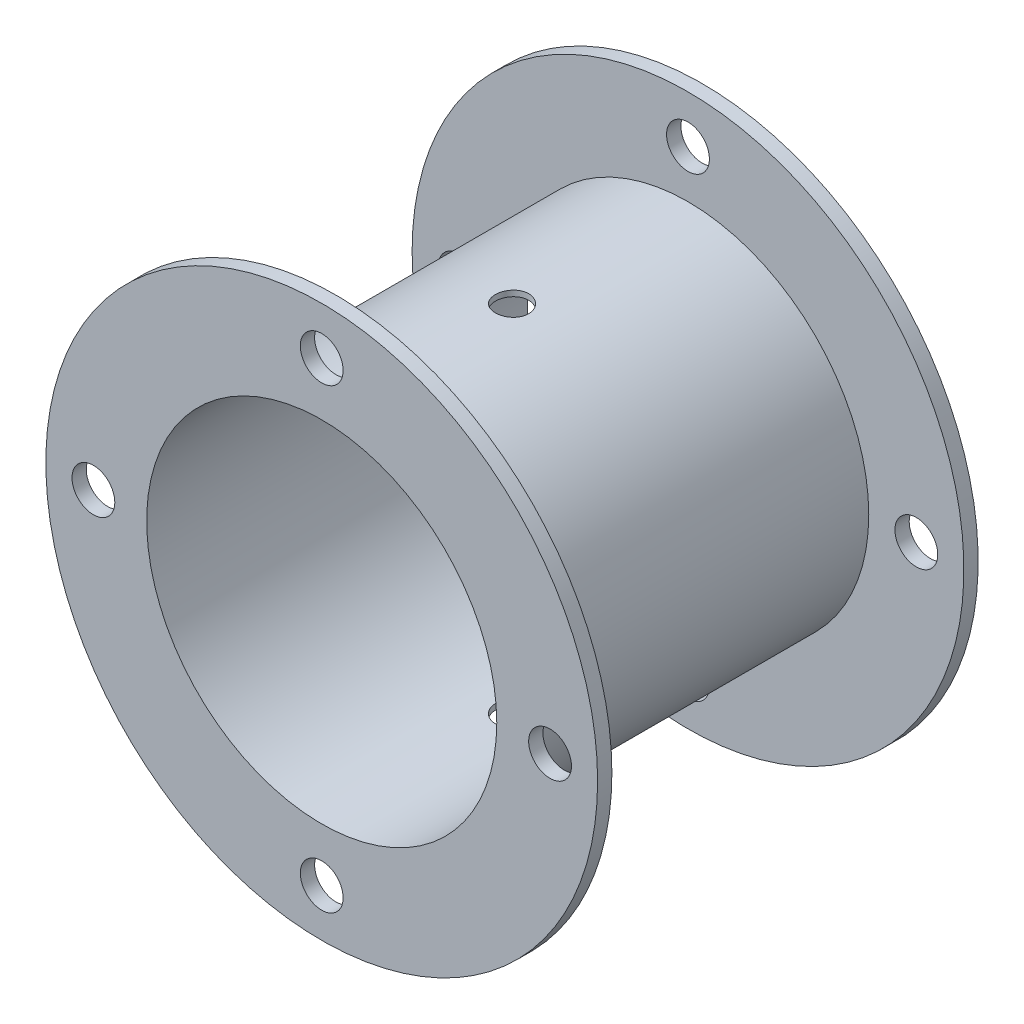
ISO-10303-21;
HEADER;
FILE_DESCRIPTION(('STEP AP214'),'2;1');
FILE_NAME('part.step','',(''),(''),'','','');
FILE_SCHEMA(('AUTOMOTIVE_DESIGN { 1 0 10303 214 1 1 1 1 }'));
ENDSEC;
DATA;
#1=APPLICATION_CONTEXT('core data for automotive mechanical design processes');
#2=APPLICATION_PROTOCOL_DEFINITION('international standard','automotive_design',2000,#1);
#3=PRODUCT_CONTEXT('',#1,'mechanical');
#4=PRODUCT('Part','Part','',(#3));
#5=PRODUCT_RELATED_PRODUCT_CATEGORY('part','',(#4));
#6=PRODUCT_DEFINITION_FORMATION('','',#4);
#7=PRODUCT_DEFINITION_CONTEXT('part definition',#1,'design');
#8=PRODUCT_DEFINITION('design','',#6,#7);
#9=PRODUCT_DEFINITION_SHAPE('','',#8);
#10=(LENGTH_UNIT() NAMED_UNIT(*) SI_UNIT(.MILLI.,.METRE.));
#11=(NAMED_UNIT(*) PLANE_ANGLE_UNIT() SI_UNIT($,.RADIAN.));
#12=(NAMED_UNIT(*) SI_UNIT($,.STERADIAN.) SOLID_ANGLE_UNIT());
#13=UNCERTAINTY_MEASURE_WITH_UNIT(LENGTH_MEASURE(1.E-05),#10,'distance_accuracy_value','');
#14=(GEOMETRIC_REPRESENTATION_CONTEXT(3) GLOBAL_UNCERTAINTY_ASSIGNED_CONTEXT((#13)) GLOBAL_UNIT_ASSIGNED_CONTEXT((#10,
#11,#12)) REPRESENTATION_CONTEXT('',''));
#15=CARTESIAN_POINT('',(0.,0.,0.));
#16=DIRECTION('',(0.,0.,1.));
#17=DIRECTION('',(1.,0.,0.));
#18=AXIS2_PLACEMENT_3D('',#15,#16,#17);
#19=CARTESIAN_POINT('',(0.,0.,80.));
#20=DIRECTION('',(0.,0.,-1.));
#21=DIRECTION('',(-1.,0.,0.));
#22=AXIS2_PLACEMENT_3D('',#19,#20,#21);
#23=CYLINDRICAL_SURFACE('',#22,38.);
#24=CARTESIAN_POINT('',(0.,0.,77.));
#25=DIRECTION('',(0.,0.,1.));
#26=DIRECTION('',(1.,0.,0.));
#27=AXIS2_PLACEMENT_3D('',#24,#25,#26);
#28=CIRCLE('',#27,38.);
#29=CARTESIAN_POINT('',(38.,0.,77.));
#30=VERTEX_POINT('',#29);
#31=EDGE_CURVE('E38',#30,#30,#28,.T.);
#32=ORIENTED_EDGE('',*,*,#31,.F.);
#33=EDGE_LOOP('',(#32));
#34=FACE_BOUND('',#33,.T.);
#35=CARTESIAN_POINT('',(0.,-38.,43.5));
#36=CARTESIAN_POINT('',(0.196150644820294,-37.9999979047221,43.4999914683142));
#37=CARTESIAN_POINT('',(0.392432884557335,-37.9984650828304,43.483455190687));
#38=CARTESIAN_POINT('',(0.779561101311674,-37.9924977373456,43.417735303349));
#39=CARTESIAN_POINT('',(0.970400756155842,-37.9880599720131,43.3685152196215));
#40=CARTESIAN_POINT('',(1.34098135315322,-37.9767839543002,43.238867982207));
#41=CARTESIAN_POINT('',(1.52072871765281,-37.9699471065974,43.1584590868663));
#42=CARTESIAN_POINT('',(1.86413444479786,-37.9546385119936,42.968750830383));
#43=CARTESIAN_POINT('',(2.0277961171604,-37.9461671024797,42.8594574295255));
#44=CARTESIAN_POINT('',(2.33492958465199,-37.9285099963569,42.614720565895));
#45=CARTESIAN_POINT('',(2.47834496663254,-37.9193224105036,42.4792064370732));
#46=CARTESIAN_POINT('',(2.74043033310537,-37.9012841843858,42.1860250010239));
#47=CARTESIAN_POINT('',(2.85909920205823,-37.8924335593257,42.0283566956519));
#48=CARTESIAN_POINT('',(3.06851878243947,-37.8760516123891,41.6949946371842));
#49=CARTESIAN_POINT('',(3.15921911197315,-37.8685226817661,41.5192691063704));
#50=CARTESIAN_POINT('',(3.30980521230169,-37.8556592176664,41.155001689945));
#51=CARTESIAN_POINT('',(3.36969163633667,-37.850324637671,40.9664600761241));
#52=CARTESIAN_POINT('',(3.45678435363085,-37.8424704319935,40.582483394705));
#53=CARTESIAN_POINT('',(3.4840834814771,-37.8399428112952,40.387069549888));
#54=CARTESIAN_POINT('',(3.50551356747673,-37.8379636949375,39.9944184490417));
#55=CARTESIAN_POINT('',(3.49964527354044,-37.8385121299145,39.7971812342287));
#56=CARTESIAN_POINT('',(3.45498371141016,-37.8426158728127,39.4071203078185));
#57=CARTESIAN_POINT('',(3.41629157129158,-37.8461619450956,39.2142849063783));
#58=CARTESIAN_POINT('',(3.3072378788012,-37.8558469568506,38.8378568508929));
#59=CARTESIAN_POINT('',(3.23687595722433,-37.8619859265506,38.6542643046284));
#60=CARTESIAN_POINT('',(3.06636759819226,-37.8761756605001,38.3012126174303));
#61=CARTESIAN_POINT('',(2.96617604348657,-37.8842293169646,38.131775387097));
#62=CARTESIAN_POINT('',(2.73888495846409,-37.9013384317566,37.812083717406));
#63=CARTESIAN_POINT('',(2.61178476085357,-37.9103939149253,37.6618297539125));
#64=CARTESIAN_POINT('',(2.33371829504063,-37.9285274872688,37.3841819485944));
#65=CARTESIAN_POINT('',(2.18266464555371,-37.9376055345223,37.2568756006666));
#66=CARTESIAN_POINT('',(1.86128326315493,-37.9547292913956,37.029414106393));
#67=CARTESIAN_POINT('',(1.69095551328887,-37.9627750001073,36.9292589839306));
#68=CARTESIAN_POINT('',(1.33580214876888,-37.9769296216879,36.7589474472372));
#69=CARTESIAN_POINT('',(1.15097452821268,-37.9830382659933,36.6887951922736));
#70=CARTESIAN_POINT('',(0.772095350053787,-37.9926275899209,36.5805434551237));
#71=CARTESIAN_POINT('',(0.578044026496838,-37.9961083361866,36.542443160097));
#72=CARTESIAN_POINT('',(0.186983884102311,-38.0000411245853,36.4994872219674));
#73=CARTESIAN_POINT('',(-0.0100115602739527,-38.0005041712397,36.4945107860255));
#74=CARTESIAN_POINT('',(-0.402033797784186,-37.9983788378088,36.5176269784321));
#75=CARTESIAN_POINT('',(-0.597060613393788,-37.9957904926006,36.5457192288072));
#76=CARTESIAN_POINT('',(-0.979262950447385,-37.9878604071442,36.6340751926183));
#77=CARTESIAN_POINT('',(-1.166451589926,-37.982523483839,36.6942826300597));
#78=CARTESIAN_POINT('',(-1.52807103626715,-37.9696953634497,36.8451022431117));
#79=CARTESIAN_POINT('',(-1.70250159848494,-37.9622041250687,36.9357150015787));
#80=CARTESIAN_POINT('',(-2.03420136182215,-37.9458787873742,37.1450746372046));
#81=CARTESIAN_POINT('',(-2.19142007560226,-37.9370409102518,37.2639012049432));
#82=CARTESIAN_POINT('',(-2.48372292647603,-37.9190269942628,37.5262007240593));
#83=CARTESIAN_POINT('',(-2.61880659317513,-37.9098509482148,37.6696741990785));
#84=CARTESIAN_POINT('',(-2.86342171901026,-37.8921620405234,37.977720479837));
#85=CARTESIAN_POINT('',(-2.97287412455199,-37.8836512832104,38.1423561986255));
#86=CARTESIAN_POINT('',(-3.16257702759339,-37.8682875646041,38.4877418503275));
#87=CARTESIAN_POINT('',(-3.24282787149239,-37.8614345836461,38.6684915920591));
#88=CARTESIAN_POINT('',(-3.37171612741817,-37.8501748802,39.040698992471));
#89=CARTESIAN_POINT('',(-3.42040124811341,-37.8457644674746,39.2321400143293));
#90=CARTESIAN_POINT('',(-3.48493113271247,-37.839877399263,39.6205218879779));
#91=CARTESIAN_POINT('',(-3.50077668340927,-37.8384006734895,39.817462607888));
#92=CARTESIAN_POINT('',(-3.49916763237338,-37.8385494473553,40.2104677919904));
#93=CARTESIAN_POINT('',(-3.48183722449488,-37.8401633771654,40.4065327809341));
#94=CARTESIAN_POINT('',(-3.41462789351965,-37.8462869883637,40.7929541410503));
#95=CARTESIAN_POINT('',(-3.36474892689354,-37.8507966736244,40.983310504588));
#96=CARTESIAN_POINT('',(-3.23389127136178,-37.8622005431004,41.3529145560671));
#97=CARTESIAN_POINT('',(-3.15291554720815,-37.8690944999939,41.5321633011128));
#98=CARTESIAN_POINT('',(-2.96217623974758,-37.8844905801757,41.8745436773478));
#99=CARTESIAN_POINT('',(-2.85241296128982,-37.892992686434,42.0376754791841));
#100=CARTESIAN_POINT('',(-2.60674740036237,-37.9106851137562,42.3438275333614));
#101=CARTESIAN_POINT('',(-2.47075278410434,-37.9198777936938,42.4867735588355));
#102=CARTESIAN_POINT('',(-2.17666158023018,-37.9378939881382,42.7478744451619));
#103=CARTESIAN_POINT('',(-2.01855968036044,-37.946717413251,42.8660233302867));
#104=CARTESIAN_POINT('',(-1.68437203955847,-37.9630204121684,43.0743720209186));
#105=CARTESIAN_POINT('',(-1.50824769738496,-37.9704970026272,43.1645100926054));
#106=CARTESIAN_POINT('',(-1.14341115422001,-37.9832303954186,43.313815731244));
#107=CARTESIAN_POINT('',(-0.954713561226897,-37.9884897235019,43.3730185559877));
#108=CARTESIAN_POINT('',(-0.637437570268632,-37.9948602550693,43.4438538968278));
#109=CARTESIAN_POINT('',(-0.510893633779581,-37.9967787779037,43.4648803080498));
#110=CARTESIAN_POINT('',(-0.256251852214102,-37.9993493327044,43.4929561231492));
#111=CARTESIAN_POINT('',(-0.128154012376229,-38.000001368939,43.5000055741329));
#112=CARTESIAN_POINT('',(0.,-38.,43.5));
#113=B_SPLINE_CURVE_WITH_KNOTS('',3,(#35,#36,#37,#38,#39,#40,#41,#42,#43,#44,#45,#46,#47,#48,
#49,#50,#51,#52,#53,#54,#55,#56,#57,#58,#59,#60,#61,#62,#63,#64,#65,#66,#67,#68,#69,#70,#71,#72,
#73,#74,#75,#76,#77,#78,#79,#80,#81,#82,#83,#84,#85,#86,#87,#88,#89,#90,#91,#92,#93,#94,#95,#96,
#97,#98,#99,#100,#101,#102,#103,#104,#105,#106,#107,#108,#109,#110,#111,#112),.UNSPECIFIED.,.T.,
.F.,(4,2,2,2,2,2,2,2,2,2,2,2,2,2,2,2,2,2,2,2,2,2,2,2,2,2,2,2,2,2,2,2,2,2,2,2,2,2,4),(0.,
0.587983998143123,1.17662527167613,1.76492246558644,2.35309835968754,2.94288206705839,
3.53269235533819,4.12355899015469,4.71441309836413,5.3035799353251,5.89273348689403,
6.48007846045749,7.06743028144327,7.65567502319846,8.24393435424464,8.83439120834051,
9.42484858182812,10.0153877833185,10.6059120082341,11.1942815819089,11.782644430614,
12.3699796517192,12.9573261324231,13.5463517472255,14.1353898778599,14.7262215095193,
15.3170461322949,15.9069756837745,16.4968911011532,17.0846024940478,17.6723146729301,
18.2599708334812,18.8476207712294,19.4373782722155,20.0272777328681,20.6184682171211,
21.2089834267417,21.5931410348112,21.9772973481595),.UNSPECIFIED.);
#114=CARTESIAN_POINT('',(0.,-38.,43.5));
#115=VERTEX_POINT('',#114);
#116=EDGE_CURVE('E81',#115,#115,#113,.T.);
#117=ORIENTED_EDGE('',*,*,#116,.T.);
#118=EDGE_LOOP('',(#117));
#119=FACE_BOUND('',#118,.T.);
#120=CARTESIAN_POINT('',(0.,38.,43.5));
#121=CARTESIAN_POINT('',(-0.196150644820289,37.9999979047221,43.4999914683142));
#122=CARTESIAN_POINT('',(-0.392432884557329,37.9984650828304,43.483455190687));
#123=CARTESIAN_POINT('',(-0.779561101311668,37.9924977373456,43.417735303349));
#124=CARTESIAN_POINT('',(-0.970400756155836,37.9880599720131,43.3685152196215));
#125=CARTESIAN_POINT('',(-1.34098135315322,37.9767839543002,43.238867982207));
#126=CARTESIAN_POINT('',(-1.5207287176528,37.9699471065974,43.1584590868663));
#127=CARTESIAN_POINT('',(-1.86413444479785,37.9546385119936,42.968750830383));
#128=CARTESIAN_POINT('',(-2.02779611716039,37.9461671024797,42.8594574295255));
#129=CARTESIAN_POINT('',(-2.33492958465198,37.9285099963569,42.614720565895));
#130=CARTESIAN_POINT('',(-2.47834496663254,37.9193224105036,42.4792064370732));
#131=CARTESIAN_POINT('',(-2.74043033310536,37.9012841843858,42.1860250010239));
#132=CARTESIAN_POINT('',(-2.85909920205823,37.8924335593257,42.0283566956519));
#133=CARTESIAN_POINT('',(-3.06851878243947,37.8760516123891,41.6949946371842));
#134=CARTESIAN_POINT('',(-3.15921911197314,37.8685226817661,41.5192691063704));
#135=CARTESIAN_POINT('',(-3.30980521230169,37.8556592176664,41.155001689945));
#136=CARTESIAN_POINT('',(-3.36969163633667,37.850324637671,40.9664600761241));
#137=CARTESIAN_POINT('',(-3.45678435363084,37.8424704319935,40.582483394705));
#138=CARTESIAN_POINT('',(-3.48408348147709,37.8399428112952,40.387069549888));
#139=CARTESIAN_POINT('',(-3.50551356747672,37.8379636949375,39.9944184490417));
#140=CARTESIAN_POINT('',(-3.49964527354043,37.8385121299145,39.7971812342287));
#141=CARTESIAN_POINT('',(-3.45498371141015,37.8426158728127,39.4071203078185));
#142=CARTESIAN_POINT('',(-3.41629157129156,37.8461619450956,39.2142849063783));
#143=CARTESIAN_POINT('',(-3.30723787880119,37.8558469568506,38.8378568508929));
#144=CARTESIAN_POINT('',(-3.23687595722432,37.8619859265506,38.6542643046284));
#145=CARTESIAN_POINT('',(-3.06636759819225,37.8761756605001,38.3012126174303));
#146=CARTESIAN_POINT('',(-2.96617604348655,37.8842293169646,38.131775387097));
#147=CARTESIAN_POINT('',(-2.73888495846407,37.9013384317566,37.812083717406));
#148=CARTESIAN_POINT('',(-2.61178476085355,37.9103939149253,37.6618297539125));
#149=CARTESIAN_POINT('',(-2.33371829504062,37.9285274872688,37.3841819485944));
#150=CARTESIAN_POINT('',(-2.1826646455537,37.9376055345223,37.2568756006666));
#151=CARTESIAN_POINT('',(-1.86128326315492,37.9547292913956,37.029414106393));
#152=CARTESIAN_POINT('',(-1.69095551328886,37.9627750001073,36.9292589839306));
#153=CARTESIAN_POINT('',(-1.33580214876887,37.9769296216879,36.7589474472372));
#154=CARTESIAN_POINT('',(-1.15097452821267,37.9830382659933,36.6887951922736));
#155=CARTESIAN_POINT('',(-0.772095350053775,37.9926275899209,36.5805434551237));
#156=CARTESIAN_POINT('',(-0.578044026496825,37.9961083361867,36.542443160097));
#157=CARTESIAN_POINT('',(-0.186983884102298,38.0000411245853,36.4994872219674));
#158=CARTESIAN_POINT('',(0.0100115602739655,38.0005041712397,36.4945107860255));
#159=CARTESIAN_POINT('',(0.402033797784199,37.9983788378088,36.5176269784321));
#160=CARTESIAN_POINT('',(0.597060613393801,37.9957904926006,36.5457192288072));
#161=CARTESIAN_POINT('',(0.979262950447397,37.9878604071442,36.6340751926183));
#162=CARTESIAN_POINT('',(1.16645158992601,37.982523483839,36.6942826300597));
#163=CARTESIAN_POINT('',(1.52807103626716,37.9696953634497,36.8451022431117));
#164=CARTESIAN_POINT('',(1.70250159848495,37.9622041250687,36.9357150015787));
#165=CARTESIAN_POINT('',(2.03420136182217,37.9458787873742,37.1450746372046));
#166=CARTESIAN_POINT('',(2.19142007560227,37.9370409102518,37.2639012049432));
#167=CARTESIAN_POINT('',(2.48372292647605,37.9190269942628,37.5262007240593));
#168=CARTESIAN_POINT('',(2.61880659317514,37.9098509482148,37.6696741990785));
#169=CARTESIAN_POINT('',(2.86342171901028,37.8921620405234,37.977720479837));
#170=CARTESIAN_POINT('',(2.972874124552,37.8836512832104,38.1423561986255));
#171=CARTESIAN_POINT('',(3.1625770275934,37.8682875646041,38.4877418503275));
#172=CARTESIAN_POINT('',(3.2428278714924,37.8614345836461,38.6684915920591));
#173=CARTESIAN_POINT('',(3.37171612741818,37.8501748802,39.040698992471));
#174=CARTESIAN_POINT('',(3.42040124811342,37.8457644674746,39.2321400143293));
#175=CARTESIAN_POINT('',(3.48493113271248,37.839877399263,39.6205218879779));
#176=CARTESIAN_POINT('',(3.50077668340928,37.8384006734895,39.8174626078879));
#177=CARTESIAN_POINT('',(3.49916763237339,37.8385494473553,40.2104677919904));
#178=CARTESIAN_POINT('',(3.48183722449489,37.8401633771654,40.4065327809341));
#179=CARTESIAN_POINT('',(3.41462789351966,37.8462869883637,40.7929541410503));
#180=CARTESIAN_POINT('',(3.36474892689355,37.8507966736244,40.983310504588));
#181=CARTESIAN_POINT('',(3.23389127136179,37.8622005431004,41.3529145560671));
#182=CARTESIAN_POINT('',(3.15291554720816,37.8690944999939,41.5321633011128));
#183=CARTESIAN_POINT('',(2.96217623974758,37.8844905801757,41.8745436773478));
#184=CARTESIAN_POINT('',(2.85241296128983,37.892992686434,42.0376754791841));
#185=CARTESIAN_POINT('',(2.60674740036238,37.9106851137562,42.3438275333614));
#186=CARTESIAN_POINT('',(2.47075278410434,37.9198777936938,42.4867735588356));
#187=CARTESIAN_POINT('',(2.17666158023019,37.9378939881382,42.7478744451619));
#188=CARTESIAN_POINT('',(2.01855968036045,37.946717413251,42.8660233302867));
#189=CARTESIAN_POINT('',(1.68437203955848,37.9630204121684,43.0743720209186));
#190=CARTESIAN_POINT('',(1.50824769738497,37.9704970026272,43.1645100926054));
#191=CARTESIAN_POINT('',(1.14341115422002,37.9832303954186,43.313815731244));
#192=CARTESIAN_POINT('',(0.954713561226906,37.9884897235019,43.3730185559877));
#193=CARTESIAN_POINT('',(0.63743757026864,37.9948602550693,43.4438538968278));
#194=CARTESIAN_POINT('',(0.510893633779588,37.9967787779037,43.4648803080498));
#195=CARTESIAN_POINT('',(0.256251852214108,37.9993493327044,43.4929561231492));
#196=CARTESIAN_POINT('',(0.128154012376234,38.000001368939,43.5000055741329));
#197=CARTESIAN_POINT('',(0.,38.,43.5));
#198=B_SPLINE_CURVE_WITH_KNOTS('',3,(#120,#121,#122,#123,#124,#125,#126,#127,#128,#129,#130,
#131,#132,#133,#134,#135,#136,#137,#138,#139,#140,#141,#142,#143,#144,#145,#146,#147,#148,#149,
#150,#151,#152,#153,#154,#155,#156,#157,#158,#159,#160,#161,#162,#163,#164,#165,#166,#167,#168,
#169,#170,#171,#172,#173,#174,#175,#176,#177,#178,#179,#180,#181,#182,#183,#184,#185,#186,#187,
#188,#189,#190,#191,#192,#193,#194,#195,#196,#197),.UNSPECIFIED.,.T.,.F.,(4,2,2,2,2,2,2,2,2,2,2,
2,2,2,2,2,2,2,2,2,2,2,2,2,2,2,2,2,2,2,2,2,2,2,2,2,2,2,4),(0.,0.587983998143122,1.17662527167613,
1.76492246558643,2.35309835968753,2.94288206705839,3.5326923553382,4.1235589901547,
4.71441309836414,5.30357993532511,5.89273348689404,6.4800784604575,7.06743028144327,
7.65567502319847,8.24393435424465,8.8343912083405,9.42484858182811,10.0153877833185,
10.605912008234,11.1942815819089,11.782644430614,12.3699796517192,12.9573261324231,
13.5463517472255,14.1353898778599,14.7262215095193,15.3170461322949,15.9069756837745,
16.4968911011532,17.0846024940478,17.6723146729301,18.2599708334812,18.8476207712294,
19.4373782722155,20.0272777328681,20.6184682171211,21.2089834267417,21.5931410348112,
21.9772973481595),.UNSPECIFIED.);
#199=CARTESIAN_POINT('',(0.,38.,43.5));
#200=VERTEX_POINT('',#199);
#201=EDGE_CURVE('E56',#200,#200,#198,.T.);
#202=ORIENTED_EDGE('',*,*,#201,.T.);
#203=EDGE_LOOP('',(#202));
#204=FACE_BOUND('',#203,.T.);
#205=CARTESIAN_POINT('',(0.,0.,3.));
#206=DIRECTION('',(0.,0.,-1.));
#207=DIRECTION('',(-1.,0.,0.));
#208=AXIS2_PLACEMENT_3D('',#205,#206,#207);
#209=CIRCLE('',#208,38.);
#210=CARTESIAN_POINT('',(-38.,0.,3.));
#211=VERTEX_POINT('',#210);
#212=EDGE_CURVE('E10',#211,#211,#209,.T.);
#213=ORIENTED_EDGE('',*,*,#212,.F.);
#214=EDGE_LOOP('',(#213));
#215=FACE_BOUND('',#214,.T.);
#216=ADVANCED_FACE('F31',(#34,#119,#204,#215),#23,.T.);
#217=CARTESIAN_POINT('',(0.,0.,80.));
#218=DIRECTION('',(0.,0.,1.));
#219=DIRECTION('',(1.,0.,0.));
#220=AXIS2_PLACEMENT_3D('',#217,#218,#219);
#221=PLANE('',#220);
#222=CARTESIAN_POINT('',(0.,0.,80.));
#223=DIRECTION('',(0.,0.,1.));
#224=DIRECTION('',(1.,0.,0.));
#225=AXIS2_PLACEMENT_3D('',#222,#223,#224);
#226=CIRCLE('',#225,36.8);
#227=CARTESIAN_POINT('',(36.8,0.,80.));
#228=VERTEX_POINT('',#227);
#229=EDGE_CURVE('E42',#228,#228,#226,.T.);
#230=ORIENTED_EDGE('',*,*,#229,.F.);
#231=EDGE_LOOP('',(#230));
#232=FACE_BOUND('',#231,.T.);
#233=CARTESIAN_POINT('',(-5.02773312793411E-13,-48.,80.));
#234=DIRECTION('',(0.,0.,1.));
#235=DIRECTION('',(1.,0.,0.));
#236=AXIS2_PLACEMENT_3D('',#233,#234,#235);
#237=CIRCLE('',#236,4.5);
#238=CARTESIAN_POINT('',(4.49999999999949,-48.,80.));
#239=VERTEX_POINT('',#238);
#240=EDGE_CURVE('E123',#239,#239,#237,.T.);
#241=ORIENTED_EDGE('',*,*,#240,.F.);
#242=EDGE_LOOP('',(#241));
#243=FACE_BOUND('',#242,.T.);
#244=CARTESIAN_POINT('',(48.,-3.35182208528941E-13,80.));
#245=DIRECTION('',(0.,0.,1.));
#246=DIRECTION('',(1.,0.,0.));
#247=AXIS2_PLACEMENT_3D('',#244,#245,#246);
#248=CIRCLE('',#247,4.5);
#249=CARTESIAN_POINT('',(52.5,-3.35182208528941E-13,80.));
#250=VERTEX_POINT('',#249);
#251=EDGE_CURVE('E127',#250,#250,#248,.T.);
#252=ORIENTED_EDGE('',*,*,#251,.F.);
#253=EDGE_LOOP('',(#252));
#254=FACE_BOUND('',#253,.T.);
#255=CARTESIAN_POINT('',(1.6759110426447E-13,48.,80.));
#256=DIRECTION('',(0.,0.,1.));
#257=DIRECTION('',(1.,0.,0.));
#258=AXIS2_PLACEMENT_3D('',#255,#256,#257);
#259=CIRCLE('',#258,4.5);
#260=CARTESIAN_POINT('',(4.50000000000017,48.,80.));
#261=VERTEX_POINT('',#260);
#262=EDGE_CURVE('E131',#261,#261,#259,.T.);
#263=ORIENTED_EDGE('',*,*,#262,.F.);
#264=EDGE_LOOP('',(#263));
#265=FACE_BOUND('',#264,.T.);
#266=CARTESIAN_POINT('',(-48.,0.,80.));
#267=DIRECTION('',(0.,0.,1.));
#268=DIRECTION('',(1.,0.,0.));
#269=AXIS2_PLACEMENT_3D('',#266,#267,#268);
#270=CIRCLE('',#269,4.5);
#271=CARTESIAN_POINT('',(-43.5,0.,80.));
#272=VERTEX_POINT('',#271);
#273=EDGE_CURVE('E135',#272,#272,#270,.T.);
#274=ORIENTED_EDGE('',*,*,#273,.F.);
#275=EDGE_LOOP('',(#274));
#276=FACE_BOUND('',#275,.T.);
#277=CARTESIAN_POINT('',(0.,0.,80.));
#278=DIRECTION('',(0.,0.,1.));
#279=DIRECTION('',(1.,0.,0.));
#280=AXIS2_PLACEMENT_3D('',#277,#278,#279);
#281=CIRCLE('',#280,58.);
#282=CARTESIAN_POINT('',(58.,0.,80.));
#283=VERTEX_POINT('',#282);
#284=EDGE_CURVE('E82',#283,#283,#281,.T.);
#285=ORIENTED_EDGE('',*,*,#284,.T.);
#286=EDGE_LOOP('',(#285));
#287=FACE_BOUND('',#286,.T.);
#288=ADVANCED_FACE('F100',(#232,#243,#254,#265,#276,#287),#221,.T.);
#289=CARTESIAN_POINT('',(0.,0.,0.));
#290=DIRECTION('',(0.,0.,1.));
#291=DIRECTION('',(1.,0.,0.));
#292=AXIS2_PLACEMENT_3D('',#289,#290,#291);
#293=PLANE('',#292);
#294=CARTESIAN_POINT('',(0.,0.,0.));
#295=DIRECTION('',(0.,0.,1.));
#296=DIRECTION('',(1.,0.,0.));
#297=AXIS2_PLACEMENT_3D('',#294,#295,#296);
#298=CIRCLE('',#297,36.8);
#299=CARTESIAN_POINT('',(36.8,0.,0.));
#300=VERTEX_POINT('',#299);
#301=EDGE_CURVE('E46',#300,#300,#298,.T.);
#302=ORIENTED_EDGE('',*,*,#301,.T.);
#303=EDGE_LOOP('',(#302));
#304=FACE_BOUND('',#303,.T.);
#305=CARTESIAN_POINT('',(1.66533453693773E-13,48.,0.));
#306=DIRECTION('',(0.,0.,-1.));
#307=DIRECTION('',(-1.,0.,0.));
#308=AXIS2_PLACEMENT_3D('',#305,#306,#307);
#309=CIRCLE('',#308,4.5);
#310=CARTESIAN_POINT('',(-4.49999999999983,48.,0.));
#311=VERTEX_POINT('',#310);
#312=EDGE_CURVE('E185',#311,#311,#309,.T.);
#313=ORIENTED_EDGE('',*,*,#312,.F.);
#314=EDGE_LOOP('',(#313));
#315=FACE_BOUND('',#314,.T.);
#316=CARTESIAN_POINT('',(48.,-3.35182208528941E-13,0.));
#317=DIRECTION('',(0.,0.,-1.));
#318=DIRECTION('',(-1.,0.,0.));
#319=AXIS2_PLACEMENT_3D('',#316,#317,#318);
#320=CIRCLE('',#319,4.5);
#321=CARTESIAN_POINT('',(43.5,-3.35182208528941E-13,0.));
#322=VERTEX_POINT('',#321);
#323=EDGE_CURVE('E179',#322,#322,#320,.T.);
#324=ORIENTED_EDGE('',*,*,#323,.F.);
#325=EDGE_LOOP('',(#324));
#326=FACE_BOUND('',#325,.T.);
#327=CARTESIAN_POINT('',(-4.9960036108132E-13,-48.,0.));
#328=DIRECTION('',(0.,0.,-1.));
#329=DIRECTION('',(-1.,0.,0.));
#330=AXIS2_PLACEMENT_3D('',#327,#328,#329);
#331=CIRCLE('',#330,4.5);
#332=CARTESIAN_POINT('',(-4.5000000000005,-48.,0.));
#333=VERTEX_POINT('',#332);
#334=EDGE_CURVE('E173',#333,#333,#331,.T.);
#335=ORIENTED_EDGE('',*,*,#334,.F.);
#336=EDGE_LOOP('',(#335));
#337=FACE_BOUND('',#336,.T.);
#338=CARTESIAN_POINT('',(-48.,0.,0.));
#339=DIRECTION('',(0.,0.,-1.));
#340=DIRECTION('',(-1.,0.,0.));
#341=AXIS2_PLACEMENT_3D('',#338,#339,#340);
#342=CIRCLE('',#341,4.5);
#343=CARTESIAN_POINT('',(-52.5,0.,0.));
#344=VERTEX_POINT('',#343);
#345=EDGE_CURVE('E167',#344,#344,#342,.T.);
#346=ORIENTED_EDGE('',*,*,#345,.F.);
#347=EDGE_LOOP('',(#346));
#348=FACE_BOUND('',#347,.T.);
#349=CARTESIAN_POINT('',(0.,0.,0.));
#350=DIRECTION('',(0.,0.,-1.));
#351=DIRECTION('',(-1.,0.,0.));
#352=AXIS2_PLACEMENT_3D('',#349,#350,#351);
#353=CIRCLE('',#352,58.);
#354=CARTESIAN_POINT('',(-58.,0.,0.));
#355=VERTEX_POINT('',#354);
#356=EDGE_CURVE('E161',#355,#355,#353,.T.);
#357=ORIENTED_EDGE('',*,*,#356,.T.);
#358=EDGE_LOOP('',(#357));
#359=FACE_BOUND('',#358,.T.);
#360=ADVANCED_FACE('F90',(#304,#315,#326,#337,#348,#359),#293,.F.);
#361=CARTESIAN_POINT('',(0.,0.,80.));
#362=DIRECTION('',(0.,0.,-1.));
#363=DIRECTION('',(-1.,0.,0.));
#364=AXIS2_PLACEMENT_3D('',#361,#362,#363);
#365=CYLINDRICAL_SURFACE('',#364,36.8);
#366=CARTESIAN_POINT('',(0.,-36.8,43.5));
#367=CARTESIAN_POINT('',(0.196121194149015,-36.7999978427233,43.4999914832489));
#368=CARTESIAN_POINT('',(0.392373255470062,-36.7984155170837,43.483460149212));
#369=CARTESIAN_POINT('',(0.779439931794322,-36.7922554548031,43.4177610464049));
#370=CARTESIAN_POINT('',(0.970248257127013,-36.7876743889387,43.3685570032759));
#371=CARTESIAN_POINT('',(1.34076605850608,-36.7760341420846,43.2389548479677));
#372=CARTESIAN_POINT('',(1.5204820330713,-36.7689764285732,43.158575205181));
#373=CARTESIAN_POINT('',(1.86383110753063,-36.7531727820549,42.9689385291873));
#374=CARTESIAN_POINT('',(2.02746747163031,-36.7444271927643,42.8596873736603));
#375=CARTESIAN_POINT('',(2.33458798679491,-36.7261960019256,42.6150247182123));
#376=CARTESIAN_POINT('',(2.47801218679278,-36.716708323533,42.4795381106485));
#377=CARTESIAN_POINT('',(2.74012206524096,-36.6980795258743,42.1864103382652));
#378=CARTESIAN_POINT('',(2.85880661780976,-36.6889384223959,42.02876816571));
#379=CARTESIAN_POINT('',(3.06827789568549,-36.6720162426829,41.6954323262696));
#380=CARTESIAN_POINT('',(3.15901080899572,-36.6642378020814,41.5197046981663));
#381=CARTESIAN_POINT('',(3.30965959692838,-36.6509468681222,41.1554220613757));
#382=CARTESIAN_POINT('',(3.36957616483912,-36.6454343237882,40.966867341373));
#383=CARTESIAN_POINT('',(3.45671478623527,-36.6373177516189,40.5828914179067));
#384=CARTESIAN_POINT('',(3.48403579528099,-36.6347049223484,40.3874928603391));
#385=CARTESIAN_POINT('',(3.50551358838834,-36.6326561566952,39.9948674583766));
#386=CARTESIAN_POINT('',(3.4996711661649,-36.6332201442805,39.7976406578508));
#387=CARTESIAN_POINT('',(3.45506956974515,-36.6374532618413,39.4076381963066));
#388=CARTESIAN_POINT('',(3.41641828403907,-36.641112214213,39.2148500709376));
#389=CARTESIAN_POINT('',(3.30746392107603,-36.6511070737068,38.8385097230223));
#390=CARTESIAN_POINT('',(3.23716045305412,-36.6574430138779,38.6549576145311));
#391=CARTESIAN_POINT('',(3.06677776169387,-36.6720896648783,38.3019579160762));
#392=CARTESIAN_POINT('',(2.96665050401804,-36.6804035570253,38.1325336482512));
#393=CARTESIAN_POINT('',(2.7394970279796,-36.6980665849354,37.8128541208207));
#394=CARTESIAN_POINT('',(2.61247009793927,-36.7074157480854,37.6625993685468));
#395=CARTESIAN_POINT('',(2.33451973121675,-36.7261412375912,37.3848969989218));
#396=CARTESIAN_POINT('',(2.18350308948544,-36.7355175237366,37.2575426485089));
#397=CARTESIAN_POINT('',(1.86218422616767,-36.7532055170226,37.0299785424306));
#398=CARTESIAN_POINT('',(1.69188198596407,-36.7615172231355,36.9297688129694));
#399=CARTESIAN_POINT('',(1.33676280820791,-36.7761419094492,36.7593429206139));
#400=CARTESIAN_POINT('',(1.15194367652545,-36.782454586782,36.6891313020978));
#401=CARTESIAN_POINT('',(0.773066694163506,-36.7923667523086,36.5807620811486));
#402=CARTESIAN_POINT('',(0.579009093484402,-36.7959663138771,36.5426036118518));
#403=CARTESIAN_POINT('',(0.187971677091728,-36.8000372538286,36.4995417562042));
#404=CARTESIAN_POINT('',(-0.00899384070933979,-36.8005207421757,36.4945096296421));
#405=CARTESIAN_POINT('',(-0.400965515739394,-36.7983374916732,36.5175054443525));
#406=CARTESIAN_POINT('',(-0.595971696843382,-36.7956707912564,36.5455329822909));
#407=CARTESIAN_POINT('',(-0.978119012715397,-36.7874946644386,36.6337457533734));
#408=CARTESIAN_POINT('',(-1.16527414159923,-36.7819905506275,36.693870896489));
#409=CARTESIAN_POINT('',(-1.52684122937879,-36.7687573370647,36.8445105114377));
#410=CARTESIAN_POINT('',(-1.70125292845566,-36.7610281919639,36.9350256026644));
#411=CARTESIAN_POINT('',(-2.03296551289773,-36.7441798761184,37.1441963244989));
#412=CARTESIAN_POINT('',(-2.19021270812055,-36.7350565465856,37.2629367591033));
#413=CARTESIAN_POINT('',(-2.48258960756047,-36.716457519107,37.5250656853869));
#414=CARTESIAN_POINT('',(-2.61771881022808,-36.7069818131767,37.6684547358493));
#415=CARTESIAN_POINT('',(-2.86246922299271,-36.6887097468182,37.9763713850552));
#416=CARTESIAN_POINT('',(-2.97200608998241,-36.6799156947665,38.14096618089));
#417=CARTESIAN_POINT('',(-3.16188314018922,-36.6640370413332,38.4862896971789));
#418=CARTESIAN_POINT('',(-3.24222368949417,-36.6569524185178,38.6670182152996));
#419=CARTESIAN_POINT('',(-3.37128555780628,-36.6453087700078,39.0391867766342));
#420=CARTESIAN_POINT('',(-3.42005751172101,-36.6407457015578,39.2306091288019));
#421=CARTESIAN_POINT('',(-3.48476220494888,-36.6346489732628,39.618971521395));
#422=CARTESIAN_POINT('',(-3.50069578837841,-36.6331152355484,39.8159114198591));
#423=CARTESIAN_POINT('',(-3.49926035278191,-36.6332523149213,40.2088802456959));
#424=CARTESIAN_POINT('',(-3.48202383275384,-36.6349103822536,40.404909675021));
#425=CARTESIAN_POINT('',(-3.41501480887397,-36.6412170948049,40.7912750832399));
#426=CARTESIAN_POINT('',(-3.36524226397024,-36.6458657437972,40.9816110549496));
#427=CARTESIAN_POINT('',(-3.23460970496162,-36.6576263557947,41.3511885481679));
#428=CARTESIAN_POINT('',(-3.15375312559551,-36.6647380466289,41.5304312929217));
#429=CARTESIAN_POINT('',(-2.96326167237086,-36.680623974581,41.8728215571391));
#430=CARTESIAN_POINT('',(-2.85362704988018,-36.689398197177,42.0359692171715));
#431=CARTESIAN_POINT('',(-2.60819363211644,-36.7076624710389,42.3422170979849));
#432=CARTESIAN_POINT('',(-2.47229623139409,-36.7171551353456,42.4852381397672));
#433=CARTESIAN_POINT('',(-2.17838618443935,-36.7357627988348,42.7465066042602));
#434=CARTESIAN_POINT('',(-2.02036823251694,-36.7448777067293,42.8647480664636));
#435=CARTESIAN_POINT('',(-1.68630890922554,-36.7617243411335,43.0733109465341));
#436=CARTESIAN_POINT('',(-1.5102267481842,-36.7694528239573,43.1635672401702));
#437=CARTESIAN_POINT('',(-1.14544788044282,-36.7826198360811,43.3131134228978));
#438=CARTESIAN_POINT('',(-0.956765759197755,-36.7880609617005,43.3724384397591));
#439=CARTESIAN_POINT('',(-0.639167653461154,-36.7946637282321,43.4435462548822));
#440=CARTESIAN_POINT('',(-0.5122858978747,-36.7966555681856,43.4646877310829));
#441=CARTESIAN_POINT('',(-0.256954819586601,-36.7993244084357,43.4929173682742));
#442=CARTESIAN_POINT('',(-0.128505502598852,-36.8000014135235,43.5000055804748));
#443=CARTESIAN_POINT('',(0.,-36.8,43.5));
#444=B_SPLINE_CURVE_WITH_KNOTS('',3,(#366,#367,#368,#369,#370,#371,#372,#373,#374,#375,#376,
#377,#378,#379,#380,#381,#382,#383,#384,#385,#386,#387,#388,#389,#390,#391,#392,#393,#394,#395,
#396,#397,#398,#399,#400,#401,#402,#403,#404,#405,#406,#407,#408,#409,#410,#411,#412,#413,#414,
#415,#416,#417,#418,#419,#420,#421,#422,#423,#424,#425,#426,#427,#428,#429,#430,#431,#432,#433,
#434,#435,#436,#437,#438,#439,#440,#441,#442,#443),.UNSPECIFIED.,.T.,.F.,(4,2,2,2,2,2,2,2,2,2,2,
2,2,2,2,2,2,2,2,2,2,2,2,2,2,2,2,2,2,2,2,2,2,2,2,2,2,2,4),(0.,0.587894350024367,1.17644249420413,
1.76464249548279,2.35272284277305,2.94251234254308,3.53232867730291,4.12327352041399,
4.71420506820828,5.30333802798468,5.89245688784332,6.47964596398507,7.06684228952258,
7.65498951775109,8.2431523083837,8.83365879116741,9.424165843995,10.0147623203473,
10.6053428237602,11.1936267689876,11.781903537115,12.3690828328161,12.9562740968571,
13.545252407201,14.1342440714174,14.7251502895581,15.3160490981671,15.9059977618616,
16.4959312606271,17.0835131425567,17.6710957658619,18.2586134808297,18.8461260641717,
19.4358889340806,20.0257935037809,20.6170607111831,21.2076549625634,21.5928654164832,
21.9780744666969),.UNSPECIFIED.);
#445=CARTESIAN_POINT('',(0.,-36.8,43.5));
#446=VERTEX_POINT('',#445);
#447=EDGE_CURVE('E49',#446,#446,#444,.T.);
#448=ORIENTED_EDGE('',*,*,#447,.F.);
#449=EDGE_LOOP('',(#448));
#450=FACE_BOUND('',#449,.T.);
#451=CARTESIAN_POINT('',(0.,36.8,43.5));
#452=CARTESIAN_POINT('',(-0.196121194149005,36.7999978427233,43.4999914832489));
#453=CARTESIAN_POINT('',(-0.392373255470052,36.7984155170837,43.483460149212));
#454=CARTESIAN_POINT('',(-0.779439931794312,36.7922554548031,43.4177610464049));
#455=CARTESIAN_POINT('',(-0.970248257127003,36.7876743889387,43.3685570032759));
#456=CARTESIAN_POINT('',(-1.34076605850607,36.7760341420846,43.2389548479677));
#457=CARTESIAN_POINT('',(-1.52048203307129,36.7689764285732,43.158575205181));
#458=CARTESIAN_POINT('',(-1.86383110753062,36.7531727820549,42.9689385291873));
#459=CARTESIAN_POINT('',(-2.0274674716303,36.7444271927643,42.8596873736603));
#460=CARTESIAN_POINT('',(-2.33458798679491,36.7261960019256,42.6150247182123));
#461=CARTESIAN_POINT('',(-2.47801218679278,36.716708323533,42.4795381106485));
#462=CARTESIAN_POINT('',(-2.74012206524095,36.6980795258743,42.1864103382652));
#463=CARTESIAN_POINT('',(-2.85880661780975,36.6889384223959,42.02876816571));
#464=CARTESIAN_POINT('',(-3.06827789568548,36.6720162426829,41.6954323262696));
#465=CARTESIAN_POINT('',(-3.15901080899571,36.6642378020814,41.5197046981663));
#466=CARTESIAN_POINT('',(-3.30965959692837,36.6509468681222,41.1554220613757));
#467=CARTESIAN_POINT('',(-3.36957616483911,36.6454343237882,40.966867341373));
#468=CARTESIAN_POINT('',(-3.45671478623526,36.6373177516189,40.5828914179067));
#469=CARTESIAN_POINT('',(-3.48403579528098,36.6347049223484,40.3874928603391));
#470=CARTESIAN_POINT('',(-3.50551358838833,36.6326561566952,39.9948674583766));
#471=CARTESIAN_POINT('',(-3.49967116616489,36.6332201442805,39.7976406578508));
#472=CARTESIAN_POINT('',(-3.45506956974514,36.6374532618413,39.4076381963066));
#473=CARTESIAN_POINT('',(-3.41641828403906,36.641112214213,39.2148500709376));
#474=CARTESIAN_POINT('',(-3.30746392107602,36.6511070737068,38.8385097230223));
#475=CARTESIAN_POINT('',(-3.23716045305411,36.6574430138779,38.6549576145311));
#476=CARTESIAN_POINT('',(-3.06677776169385,36.6720896648783,38.3019579160762));
#477=CARTESIAN_POINT('',(-2.96665050401803,36.6804035570253,38.1325336482512));
#478=CARTESIAN_POINT('',(-2.73949702797958,36.6980665849354,37.8128541208207));
#479=CARTESIAN_POINT('',(-2.61247009793926,36.7074157480854,37.6625993685468));
#480=CARTESIAN_POINT('',(-2.33451973121674,36.7261412375912,37.3848969989218));
#481=CARTESIAN_POINT('',(-2.18350308948543,36.7355175237366,37.2575426485089));
#482=CARTESIAN_POINT('',(-1.86218422616765,36.7532055170226,37.0299785424306));
#483=CARTESIAN_POINT('',(-1.69188198596405,36.7615172231355,36.9297688129694));
#484=CARTESIAN_POINT('',(-1.3367628082079,36.7761419094492,36.7593429206139));
#485=CARTESIAN_POINT('',(-1.15194367652544,36.782454586782,36.6891313020978));
#486=CARTESIAN_POINT('',(-0.773066694163497,36.7923667523086,36.5807620811486));
#487=CARTESIAN_POINT('',(-0.579009093484393,36.7959663138771,36.5426036118518));
#488=CARTESIAN_POINT('',(-0.187971677091719,36.8000372538286,36.4995417562042));
#489=CARTESIAN_POINT('',(0.00899384070934855,36.8005207421757,36.4945096296421));
#490=CARTESIAN_POINT('',(0.400965515739403,36.7983374916732,36.5175054443525));
#491=CARTESIAN_POINT('',(0.595971696843391,36.7956707912564,36.5455329822908));
#492=CARTESIAN_POINT('',(0.978119012715408,36.7874946644386,36.6337457533733));
#493=CARTESIAN_POINT('',(1.16527414159925,36.7819905506275,36.693870896489));
#494=CARTESIAN_POINT('',(1.5268412293788,36.7687573370647,36.8445105114377));
#495=CARTESIAN_POINT('',(1.70125292845567,36.7610281919639,36.9350256026644));
#496=CARTESIAN_POINT('',(2.03296551289774,36.7441798761184,37.1441963244989));
#497=CARTESIAN_POINT('',(2.19021270812056,36.7350565465856,37.2629367591032));
#498=CARTESIAN_POINT('',(2.48258960756048,36.716457519107,37.5250656853869));
#499=CARTESIAN_POINT('',(2.61771881022809,36.7069818131767,37.6684547358493));
#500=CARTESIAN_POINT('',(2.86246922299272,36.6887097468182,37.9763713850552));
#501=CARTESIAN_POINT('',(2.97200608998242,36.6799156947665,38.14096618089));
#502=CARTESIAN_POINT('',(3.16188314018923,36.6640370413332,38.4862896971789));
#503=CARTESIAN_POINT('',(3.24222368949418,36.6569524185178,38.6670182152996));
#504=CARTESIAN_POINT('',(3.37128555780629,36.6453087700078,39.0391867766342));
#505=CARTESIAN_POINT('',(3.42005751172102,36.6407457015578,39.2306091288019));
#506=CARTESIAN_POINT('',(3.48476220494889,36.6346489732628,39.618971521395));
#507=CARTESIAN_POINT('',(3.50069578837842,36.6331152355484,39.8159114198591));
#508=CARTESIAN_POINT('',(3.49926035278193,36.6332523149213,40.2088802456959));
#509=CARTESIAN_POINT('',(3.48202383275385,36.6349103822536,40.404909675021));
#510=CARTESIAN_POINT('',(3.41501480887398,36.6412170948049,40.7912750832399));
#511=CARTESIAN_POINT('',(3.36524226397025,36.6458657437972,40.9816110549496));
#512=CARTESIAN_POINT('',(3.23460970496163,36.6576263557947,41.3511885481679));
#513=CARTESIAN_POINT('',(3.15375312559552,36.6647380466289,41.5304312929217));
#514=CARTESIAN_POINT('',(2.96326167237087,36.680623974581,41.8728215571391));
#515=CARTESIAN_POINT('',(2.85362704988019,36.689398197177,42.0359692171715));
#516=CARTESIAN_POINT('',(2.60819363211645,36.7076624710389,42.3422170979849));
#517=CARTESIAN_POINT('',(2.4722962313941,36.7171551353456,42.4852381397672));
#518=CARTESIAN_POINT('',(2.17838618443936,36.7357627988348,42.7465066042602));
#519=CARTESIAN_POINT('',(2.02036823251695,36.7448777067293,42.8647480664636));
#520=CARTESIAN_POINT('',(1.68630890922555,36.7617243411335,43.0733109465341));
#521=CARTESIAN_POINT('',(1.51022674818421,36.7694528239573,43.1635672401702));
#522=CARTESIAN_POINT('',(1.14544788044283,36.7826198360811,43.3131134228978));
#523=CARTESIAN_POINT('',(0.956765759197767,36.7880609617005,43.3724384397591));
#524=CARTESIAN_POINT('',(0.639167653461164,36.7946637282321,43.4435462548822));
#525=CARTESIAN_POINT('',(0.51228589787471,36.7966555681856,43.4646877310829));
#526=CARTESIAN_POINT('',(0.25695481958661,36.7993244084357,43.4929173682742));
#527=CARTESIAN_POINT('',(0.128505502598862,36.8000014135235,43.5000055804748));
#528=CARTESIAN_POINT('',(0.,36.8,43.5));
#529=B_SPLINE_CURVE_WITH_KNOTS('',3,(#451,#452,#453,#454,#455,#456,#457,#458,#459,#460,#461,
#462,#463,#464,#465,#466,#467,#468,#469,#470,#471,#472,#473,#474,#475,#476,#477,#478,#479,#480,
#481,#482,#483,#484,#485,#486,#487,#488,#489,#490,#491,#492,#493,#494,#495,#496,#497,#498,#499,
#500,#501,#502,#503,#504,#505,#506,#507,#508,#509,#510,#511,#512,#513,#514,#515,#516,#517,#518,
#519,#520,#521,#522,#523,#524,#525,#526,#527,#528),.UNSPECIFIED.,.T.,.F.,(4,2,2,2,2,2,2,2,2,2,2,
2,2,2,2,2,2,2,2,2,2,2,2,2,2,2,2,2,2,2,2,2,2,2,2,2,2,2,4),(0.,0.587894350024367,1.17644249420413,
1.76464249548279,2.35272284277305,2.94251234254309,3.53232867730291,4.12327352041399,
4.71420506820828,5.30333802798468,5.89245688784332,6.47964596398507,7.06684228952259,
7.6549895177511,8.2431523083837,8.83365879116742,9.424165843995,10.0147623203473,
10.6053428237602,11.1936267689876,11.781903537115,12.3690828328161,12.9562740968571,
13.545252407201,14.1342440714174,14.7251502895581,15.3160490981671,15.9059977618616,
16.4959312606271,17.0835131425567,17.6710957658619,18.2586134808297,18.8461260641717,
19.4358889340806,20.0257935037809,20.6170607111831,21.2076549625634,21.5928654164832,
21.9780744666969),.UNSPECIFIED.);
#530=CARTESIAN_POINT('',(0.,36.8,43.5));
#531=VERTEX_POINT('',#530);
#532=EDGE_CURVE('E57',#531,#531,#529,.T.);
#533=ORIENTED_EDGE('',*,*,#532,.F.);
#534=EDGE_LOOP('',(#533));
#535=FACE_BOUND('',#534,.T.);
#536=ORIENTED_EDGE('',*,*,#229,.T.);
#537=EDGE_LOOP('',(#536));
#538=FACE_BOUND('',#537,.T.);
#539=ORIENTED_EDGE('',*,*,#301,.F.);
#540=EDGE_LOOP('',(#539));
#541=FACE_BOUND('',#540,.T.);
#542=ADVANCED_FACE('F61',(#450,#535,#538,#541),#365,.F.);
#543=CARTESIAN_POINT('',(0.,-38.,40.));
#544=DIRECTION('',(0.,1.,0.));
#545=DIRECTION('',(0.,0.,1.));
#546=AXIS2_PLACEMENT_3D('',#543,#544,#545);
#547=CYLINDRICAL_SURFACE('',#546,3.5);
#548=ORIENTED_EDGE('',*,*,#532,.T.);
#549=EDGE_LOOP('',(#548));
#550=FACE_BOUND('',#549,.T.);
#551=ORIENTED_EDGE('',*,*,#201,.F.);
#552=EDGE_LOOP('',(#551));
#553=FACE_BOUND('',#552,.T.);
#554=ADVANCED_FACE('F69',(#550,#553),#547,.F.);
#555=ORIENTED_EDGE('',*,*,#447,.T.);
#556=EDGE_LOOP('',(#555));
#557=FACE_BOUND('',#556,.T.);
#558=ORIENTED_EDGE('',*,*,#116,.F.);
#559=EDGE_LOOP('',(#558));
#560=FACE_BOUND('',#559,.T.);
#561=ADVANCED_FACE('F64',(#557,#560),#547,.F.);
#562=CARTESIAN_POINT('',(0.,0.,77.));
#563=DIRECTION('',(0.,0.,1.));
#564=DIRECTION('',(1.,0.,0.));
#565=AXIS2_PLACEMENT_3D('',#562,#563,#564);
#566=CYLINDRICAL_SURFACE('',#565,58.);
#567=CARTESIAN_POINT('',(0.,0.,77.));
#568=DIRECTION('',(0.,0.,1.));
#569=DIRECTION('',(1.,0.,0.));
#570=AXIS2_PLACEMENT_3D('',#567,#568,#569);
#571=CIRCLE('',#570,58.);
#572=CARTESIAN_POINT('',(58.,0.,77.));
#573=VERTEX_POINT('',#572);
#574=EDGE_CURVE('E139',#573,#573,#571,.T.);
#575=ORIENTED_EDGE('',*,*,#574,.T.);
#576=EDGE_LOOP('',(#575));
#577=FACE_BOUND('',#576,.T.);
#578=ORIENTED_EDGE('',*,*,#284,.F.);
#579=EDGE_LOOP('',(#578));
#580=FACE_BOUND('',#579,.T.);
#581=ADVANCED_FACE('F68',(#577,#580),#566,.T.);
#582=CARTESIAN_POINT('',(0.,0.,77.));
#583=DIRECTION('',(0.,0.,1.));
#584=DIRECTION('',(1.,0.,0.));
#585=AXIS2_PLACEMENT_3D('',#582,#583,#584);
#586=PLANE('',#585);
#587=CARTESIAN_POINT('',(-5.02773312793411E-13,-48.,77.));
#588=DIRECTION('',(0.,0.,1.));
#589=DIRECTION('',(1.,0.,0.));
#590=AXIS2_PLACEMENT_3D('',#587,#588,#589);
#591=CIRCLE('',#590,4.5);
#592=CARTESIAN_POINT('',(4.49999999999949,-48.,77.));
#593=VERTEX_POINT('',#592);
#594=EDGE_CURVE('E154',#593,#593,#591,.T.);
#595=ORIENTED_EDGE('',*,*,#594,.T.);
#596=EDGE_LOOP('',(#595));
#597=FACE_BOUND('',#596,.T.);
#598=CARTESIAN_POINT('',(48.,-3.35182208528941E-13,77.));
#599=DIRECTION('',(0.,0.,1.));
#600=DIRECTION('',(1.,0.,0.));
#601=AXIS2_PLACEMENT_3D('',#598,#599,#600);
#602=CIRCLE('',#601,4.5);
#603=CARTESIAN_POINT('',(52.5,-3.35182208528941E-13,77.));
#604=VERTEX_POINT('',#603);
#605=EDGE_CURVE('E150',#604,#604,#602,.T.);
#606=ORIENTED_EDGE('',*,*,#605,.T.);
#607=EDGE_LOOP('',(#606));
#608=FACE_BOUND('',#607,.T.);
#609=CARTESIAN_POINT('',(1.6759110426447E-13,48.,77.));
#610=DIRECTION('',(0.,0.,1.));
#611=DIRECTION('',(1.,0.,0.));
#612=AXIS2_PLACEMENT_3D('',#609,#610,#611);
#613=CIRCLE('',#612,4.5);
#614=CARTESIAN_POINT('',(4.50000000000017,48.,77.));
#615=VERTEX_POINT('',#614);
#616=EDGE_CURVE('E146',#615,#615,#613,.T.);
#617=ORIENTED_EDGE('',*,*,#616,.T.);
#618=EDGE_LOOP('',(#617));
#619=FACE_BOUND('',#618,.T.);
#620=CARTESIAN_POINT('',(-48.,0.,77.));
#621=DIRECTION('',(0.,0.,1.));
#622=DIRECTION('',(1.,0.,0.));
#623=AXIS2_PLACEMENT_3D('',#620,#621,#622);
#624=CIRCLE('',#623,4.5);
#625=CARTESIAN_POINT('',(-43.5,0.,77.));
#626=VERTEX_POINT('',#625);
#627=EDGE_CURVE('E140',#626,#626,#624,.T.);
#628=ORIENTED_EDGE('',*,*,#627,.T.);
#629=EDGE_LOOP('',(#628));
#630=FACE_BOUND('',#629,.T.);
#631=ORIENTED_EDGE('',*,*,#31,.T.);
#632=EDGE_LOOP('',(#631));
#633=FACE_BOUND('',#632,.T.);
#634=ORIENTED_EDGE('',*,*,#574,.F.);
#635=EDGE_LOOP('',(#634));
#636=FACE_BOUND('',#635,.T.);
#637=ADVANCED_FACE('F234',(#597,#608,#619,#630,#633,#636),#586,.F.);
#638=CARTESIAN_POINT('',(-48.,0.,77.));
#639=DIRECTION('',(0.,0.,1.));
#640=DIRECTION('',(1.,0.,0.));
#641=AXIS2_PLACEMENT_3D('',#638,#639,#640);
#642=CYLINDRICAL_SURFACE('',#641,4.5);
#643=ORIENTED_EDGE('',*,*,#627,.F.);
#644=EDGE_LOOP('',(#643));
#645=FACE_BOUND('',#644,.T.);
#646=ORIENTED_EDGE('',*,*,#273,.T.);
#647=EDGE_LOOP('',(#646));
#648=FACE_BOUND('',#647,.T.);
#649=ADVANCED_FACE('F231',(#645,#648),#642,.F.);
#650=CARTESIAN_POINT('',(1.6759110426447E-13,48.,77.));
#651=DIRECTION('',(0.,0.,1.));
#652=DIRECTION('',(1.,0.,0.));
#653=AXIS2_PLACEMENT_3D('',#650,#651,#652);
#654=CYLINDRICAL_SURFACE('',#653,4.5);
#655=ORIENTED_EDGE('',*,*,#616,.F.);
#656=EDGE_LOOP('',(#655));
#657=FACE_BOUND('',#656,.T.);
#658=ORIENTED_EDGE('',*,*,#262,.T.);
#659=EDGE_LOOP('',(#658));
#660=FACE_BOUND('',#659,.T.);
#661=ADVANCED_FACE('F227',(#657,#660),#654,.F.);
#662=CARTESIAN_POINT('',(48.,-3.35182208528941E-13,77.));
#663=DIRECTION('',(0.,0.,1.));
#664=DIRECTION('',(1.,0.,0.));
#665=AXIS2_PLACEMENT_3D('',#662,#663,#664);
#666=CYLINDRICAL_SURFACE('',#665,4.5);
#667=ORIENTED_EDGE('',*,*,#605,.F.);
#668=EDGE_LOOP('',(#667));
#669=FACE_BOUND('',#668,.T.);
#670=ORIENTED_EDGE('',*,*,#251,.T.);
#671=EDGE_LOOP('',(#670));
#672=FACE_BOUND('',#671,.T.);
#673=ADVANCED_FACE('F220',(#669,#672),#666,.F.);
#674=CARTESIAN_POINT('',(-5.02773312793411E-13,-48.,77.));
#675=DIRECTION('',(0.,0.,1.));
#676=DIRECTION('',(1.,0.,0.));
#677=AXIS2_PLACEMENT_3D('',#674,#675,#676);
#678=CYLINDRICAL_SURFACE('',#677,4.5);
#679=ORIENTED_EDGE('',*,*,#594,.F.);
#680=EDGE_LOOP('',(#679));
#681=FACE_BOUND('',#680,.T.);
#682=ORIENTED_EDGE('',*,*,#240,.T.);
#683=EDGE_LOOP('',(#682));
#684=FACE_BOUND('',#683,.T.);
#685=ADVANCED_FACE('F211',(#681,#684),#678,.F.);
#686=CARTESIAN_POINT('',(0.,0.,3.));
#687=DIRECTION('',(0.,0.,-1.));
#688=DIRECTION('',(-1.,0.,0.));
#689=AXIS2_PLACEMENT_3D('',#686,#687,#688);
#690=CYLINDRICAL_SURFACE('',#689,58.);
#691=CARTESIAN_POINT('',(0.,0.,3.));
#692=DIRECTION('',(0.,0.,-1.));
#693=DIRECTION('',(-1.,0.,0.));
#694=AXIS2_PLACEMENT_3D('',#691,#692,#693);
#695=CIRCLE('',#694,58.);
#696=CARTESIAN_POINT('',(-58.,0.,3.));
#697=VERTEX_POINT('',#696);
#698=EDGE_CURVE('E158',#697,#697,#695,.T.);
#699=ORIENTED_EDGE('',*,*,#698,.T.);
#700=EDGE_LOOP('',(#699));
#701=FACE_BOUND('',#700,.T.);
#702=ORIENTED_EDGE('',*,*,#356,.F.);
#703=EDGE_LOOP('',(#702));
#704=FACE_BOUND('',#703,.T.);
#705=ADVANCED_FACE('F209',(#701,#704),#690,.T.);
#706=CARTESIAN_POINT('',(0.,0.,3.));
#707=DIRECTION('',(0.,0.,-1.));
#708=DIRECTION('',(-1.,0.,0.));
#709=AXIS2_PLACEMENT_3D('',#706,#707,#708);
#710=PLANE('',#709);
#711=CARTESIAN_POINT('',(1.66533453693773E-13,48.,3.));
#712=DIRECTION('',(0.,0.,-1.));
#713=DIRECTION('',(-1.,0.,0.));
#714=AXIS2_PLACEMENT_3D('',#711,#712,#713);
#715=CIRCLE('',#714,4.5);
#716=CARTESIAN_POINT('',(-4.49999999999983,48.,3.));
#717=VERTEX_POINT('',#716);
#718=EDGE_CURVE('E182',#717,#717,#715,.T.);
#719=ORIENTED_EDGE('',*,*,#718,.T.);
#720=EDGE_LOOP('',(#719));
#721=FACE_BOUND('',#720,.T.);
#722=CARTESIAN_POINT('',(48.,-3.35182208528941E-13,3.));
#723=DIRECTION('',(0.,0.,-1.));
#724=DIRECTION('',(-1.,0.,0.));
#725=AXIS2_PLACEMENT_3D('',#722,#723,#724);
#726=CIRCLE('',#725,4.5);
#727=CARTESIAN_POINT('',(43.5,-3.35182208528941E-13,3.));
#728=VERTEX_POINT('',#727);
#729=EDGE_CURVE('E176',#728,#728,#726,.T.);
#730=ORIENTED_EDGE('',*,*,#729,.T.);
#731=EDGE_LOOP('',(#730));
#732=FACE_BOUND('',#731,.T.);
#733=CARTESIAN_POINT('',(-4.9960036108132E-13,-48.,3.));
#734=DIRECTION('',(0.,0.,-1.));
#735=DIRECTION('',(-1.,0.,0.));
#736=AXIS2_PLACEMENT_3D('',#733,#734,#735);
#737=CIRCLE('',#736,4.5);
#738=CARTESIAN_POINT('',(-4.5000000000005,-48.,3.));
#739=VERTEX_POINT('',#738);
#740=EDGE_CURVE('E170',#739,#739,#737,.T.);
#741=ORIENTED_EDGE('',*,*,#740,.T.);
#742=EDGE_LOOP('',(#741));
#743=FACE_BOUND('',#742,.T.);
#744=CARTESIAN_POINT('',(-48.,0.,3.));
#745=DIRECTION('',(0.,0.,-1.));
#746=DIRECTION('',(-1.,0.,0.));
#747=AXIS2_PLACEMENT_3D('',#744,#745,#746);
#748=CIRCLE('',#747,4.5);
#749=CARTESIAN_POINT('',(-52.5,0.,3.));
#750=VERTEX_POINT('',#749);
#751=EDGE_CURVE('E164',#750,#750,#748,.T.);
#752=ORIENTED_EDGE('',*,*,#751,.T.);
#753=EDGE_LOOP('',(#752));
#754=FACE_BOUND('',#753,.T.);
#755=ORIENTED_EDGE('',*,*,#212,.T.);
#756=EDGE_LOOP('',(#755));
#757=FACE_BOUND('',#756,.T.);
#758=ORIENTED_EDGE('',*,*,#698,.F.);
#759=EDGE_LOOP('',(#758));
#760=FACE_BOUND('',#759,.T.);
#761=ADVANCED_FACE('F191',(#721,#732,#743,#754,#757,#760),#710,.F.);
#762=CARTESIAN_POINT('',(-48.,0.,3.));
#763=DIRECTION('',(0.,0.,-1.));
#764=DIRECTION('',(-1.,0.,0.));
#765=AXIS2_PLACEMENT_3D('',#762,#763,#764);
#766=CYLINDRICAL_SURFACE('',#765,4.5);
#767=ORIENTED_EDGE('',*,*,#751,.F.);
#768=EDGE_LOOP('',(#767));
#769=FACE_BOUND('',#768,.T.);
#770=ORIENTED_EDGE('',*,*,#345,.T.);
#771=EDGE_LOOP('',(#770));
#772=FACE_BOUND('',#771,.T.);
#773=ADVANCED_FACE('F218',(#769,#772),#766,.F.);
#774=CARTESIAN_POINT('',(-4.9960036108132E-13,-48.,3.));
#775=DIRECTION('',(0.,0.,-1.));
#776=DIRECTION('',(-1.,0.,0.));
#777=AXIS2_PLACEMENT_3D('',#774,#775,#776);
#778=CYLINDRICAL_SURFACE('',#777,4.5);
#779=ORIENTED_EDGE('',*,*,#740,.F.);
#780=EDGE_LOOP('',(#779));
#781=FACE_BOUND('',#780,.T.);
#782=ORIENTED_EDGE('',*,*,#334,.T.);
#783=EDGE_LOOP('',(#782));
#784=FACE_BOUND('',#783,.T.);
#785=ADVANCED_FACE('F333',(#781,#784),#778,.F.);
#786=CARTESIAN_POINT('',(48.,-3.35182208528941E-13,3.));
#787=DIRECTION('',(0.,0.,-1.));
#788=DIRECTION('',(-1.,0.,0.));
#789=AXIS2_PLACEMENT_3D('',#786,#787,#788);
#790=CYLINDRICAL_SURFACE('',#789,4.5);
#791=ORIENTED_EDGE('',*,*,#729,.F.);
#792=EDGE_LOOP('',(#791));
#793=FACE_BOUND('',#792,.T.);
#794=ORIENTED_EDGE('',*,*,#323,.T.);
#795=EDGE_LOOP('',(#794));
#796=FACE_BOUND('',#795,.T.);
#797=ADVANCED_FACE('F197',(#793,#796),#790,.F.);
#798=CARTESIAN_POINT('',(1.66533453693773E-13,48.,3.));
#799=DIRECTION('',(0.,0.,-1.));
#800=DIRECTION('',(-1.,0.,0.));
#801=AXIS2_PLACEMENT_3D('',#798,#799,#800);
#802=CYLINDRICAL_SURFACE('',#801,4.5);
#803=ORIENTED_EDGE('',*,*,#718,.F.);
#804=EDGE_LOOP('',(#803));
#805=FACE_BOUND('',#804,.T.);
#806=ORIENTED_EDGE('',*,*,#312,.T.);
#807=EDGE_LOOP('',(#806));
#808=FACE_BOUND('',#807,.T.);
#809=ADVANCED_FACE('F194',(#805,#808),#802,.F.);
#810=CLOSED_SHELL('',(#216,#288,#360,#542,#554,#561,#581,#637,#649,#661,#673,#685,#705,#761,
#773,#785,#797,#809));
#811=MANIFOLD_SOLID_BREP('B2',#810);
#812=ADVANCED_BREP_SHAPE_REPRESENTATION('',(#18,#811),#14);
#813=SHAPE_DEFINITION_REPRESENTATION(#9,#812);
ENDSEC;
END-ISO-10303-21;
